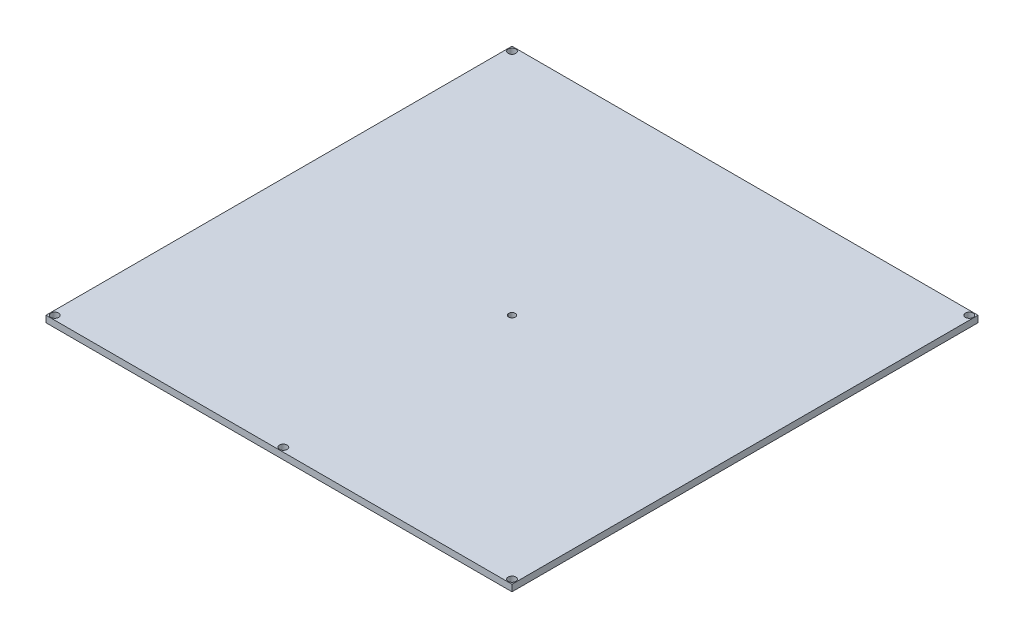
ISO-10303-21;
HEADER;
FILE_DESCRIPTION(('STEP AP214'),'2;1');
FILE_NAME('part.step','',(''),(''),'','','');
FILE_SCHEMA(('AUTOMOTIVE_DESIGN { 1 0 10303 214 1 1 1 1 }'));
ENDSEC;
DATA;
#1=APPLICATION_CONTEXT('core data for automotive mechanical design processes');
#2=APPLICATION_PROTOCOL_DEFINITION('international standard','automotive_design',2000,#1);
#3=PRODUCT_CONTEXT('',#1,'mechanical');
#4=PRODUCT('Part','Part','',(#3));
#5=PRODUCT_RELATED_PRODUCT_CATEGORY('part','',(#4));
#6=PRODUCT_DEFINITION_FORMATION('','',#4);
#7=PRODUCT_DEFINITION_CONTEXT('part definition',#1,'design');
#8=PRODUCT_DEFINITION('design','',#6,#7);
#9=PRODUCT_DEFINITION_SHAPE('','',#8);
#10=(LENGTH_UNIT() NAMED_UNIT(*) SI_UNIT(.MILLI.,.METRE.));
#11=(NAMED_UNIT(*) PLANE_ANGLE_UNIT() SI_UNIT($,.RADIAN.));
#12=(NAMED_UNIT(*) SI_UNIT($,.STERADIAN.) SOLID_ANGLE_UNIT());
#13=UNCERTAINTY_MEASURE_WITH_UNIT(LENGTH_MEASURE(1.E-05),#10,'distance_accuracy_value','');
#14=(GEOMETRIC_REPRESENTATION_CONTEXT(3) GLOBAL_UNCERTAINTY_ASSIGNED_CONTEXT((#13)) GLOBAL_UNIT_ASSIGNED_CONTEXT((#10,
#11,#12)) REPRESENTATION_CONTEXT('',''));
#15=CARTESIAN_POINT('',(0.,0.,0.));
#16=DIRECTION('',(0.,0.,1.));
#17=DIRECTION('',(1.,0.,0.));
#18=AXIS2_PLACEMENT_3D('',#15,#16,#17);
#19=CARTESIAN_POINT('',(0.,3.,0.));
#20=DIRECTION('',(0.,-1.,0.));
#21=DIRECTION('',(0.,0.,-1.));
#22=AXIS2_PLACEMENT_3D('',#19,#20,#21);
#23=PLANE('',#22);
#24=DIRECTION('',(0.,0.,-1.));
#25=VECTOR('',#24,1.);
#26=CARTESIAN_POINT('',(106.5,3.,106.5));
#27=LINE('',#26,#25);
#28=CARTESIAN_POINT('',(106.5,3.,106.5));
#29=VERTEX_POINT('',#28);
#30=CARTESIAN_POINT('',(106.5,3.,-106.5));
#31=VERTEX_POINT('',#30);
#32=EDGE_CURVE('E98',#29,#31,#27,.T.);
#33=ORIENTED_EDGE('',*,*,#32,.T.);
#34=DIRECTION('',(-1.,0.,0.));
#35=VECTOR('',#34,1.);
#36=CARTESIAN_POINT('',(-106.5,3.,-106.5));
#37=LINE('',#36,#35);
#38=CARTESIAN_POINT('',(-106.5,3.,-106.5));
#39=VERTEX_POINT('',#38);
#40=EDGE_CURVE('E93',#31,#39,#37,.T.);
#41=ORIENTED_EDGE('',*,*,#40,.T.);
#42=DIRECTION('',(0.,0.,1.));
#43=VECTOR('',#42,1.);
#44=CARTESIAN_POINT('',(-106.5,3.,106.5));
#45=LINE('',#44,#43);
#46=CARTESIAN_POINT('',(-106.5,3.,106.5));
#47=VERTEX_POINT('',#46);
#48=EDGE_CURVE('E96',#39,#47,#45,.T.);
#49=ORIENTED_EDGE('',*,*,#48,.T.);
#50=DIRECTION('',(1.,0.,0.));
#51=VECTOR('',#50,1.);
#52=CARTESIAN_POINT('',(-106.5,3.,106.5));
#53=LINE('',#52,#51);
#54=EDGE_CURVE('E63',#47,#29,#53,.T.);
#55=ORIENTED_EDGE('',*,*,#54,.T.);
#56=EDGE_LOOP('',(#33,#41,#49,#55));
#57=FACE_BOUND('',#56,.T.);
#58=CARTESIAN_POINT('',(-104.5,3.,-104.5));
#59=DIRECTION('',(0.,1.,0.));
#60=DIRECTION('',(0.,0.,1.));
#61=AXIS2_PLACEMENT_3D('',#58,#59,#60);
#62=CIRCLE('',#61,1.75);
#63=CARTESIAN_POINT('',(-104.5,3.,-102.75));
#64=VERTEX_POINT('',#63);
#65=EDGE_CURVE('E118',#64,#64,#62,.T.);
#66=ORIENTED_EDGE('',*,*,#65,.F.);
#67=EDGE_LOOP('',(#66));
#68=FACE_BOUND('',#67,.T.);
#69=CARTESIAN_POINT('',(2.15105711021124E-12,3.,104.5));
#70=DIRECTION('',(0.,1.,0.));
#71=DIRECTION('',(0.,0.,1.));
#72=AXIS2_PLACEMENT_3D('',#69,#70,#71);
#73=CIRCLE('',#72,1.75);
#74=CARTESIAN_POINT('',(2.15105711021124E-12,3.,106.25));
#75=VERTEX_POINT('',#74);
#76=EDGE_CURVE('E140',#75,#75,#73,.T.);
#77=ORIENTED_EDGE('',*,*,#76,.F.);
#78=EDGE_LOOP('',(#77));
#79=FACE_BOUND('',#78,.T.);
#80=CARTESIAN_POINT('',(104.5,3.,-104.5));
#81=DIRECTION('',(0.,1.,0.));
#82=DIRECTION('',(0.,0.,1.));
#83=AXIS2_PLACEMENT_3D('',#80,#81,#82);
#84=CIRCLE('',#83,1.75);
#85=CARTESIAN_POINT('',(104.5,3.,-102.75));
#86=VERTEX_POINT('',#85);
#87=EDGE_CURVE('E148',#86,#86,#84,.T.);
#88=ORIENTED_EDGE('',*,*,#87,.F.);
#89=EDGE_LOOP('',(#88));
#90=FACE_BOUND('',#89,.T.);
#91=CARTESIAN_POINT('',(-104.499999999998,3.,104.5));
#92=DIRECTION('',(0.,1.,0.));
#93=DIRECTION('',(0.,0.,1.));
#94=AXIS2_PLACEMENT_3D('',#91,#92,#93);
#95=CIRCLE('',#94,1.75);
#96=CARTESIAN_POINT('',(-104.499999999998,3.,106.25));
#97=VERTEX_POINT('',#96);
#98=EDGE_CURVE('E156',#97,#97,#95,.T.);
#99=ORIENTED_EDGE('',*,*,#98,.F.);
#100=EDGE_LOOP('',(#99));
#101=FACE_BOUND('',#100,.T.);
#102=CARTESIAN_POINT('',(104.500000000002,3.,104.5));
#103=DIRECTION('',(0.,1.,0.));
#104=DIRECTION('',(0.,0.,1.));
#105=AXIS2_PLACEMENT_3D('',#102,#103,#104);
#106=CIRCLE('',#105,1.75);
#107=CARTESIAN_POINT('',(104.500000000002,3.,106.25));
#108=VERTEX_POINT('',#107);
#109=EDGE_CURVE('E164',#108,#108,#106,.T.);
#110=ORIENTED_EDGE('',*,*,#109,.F.);
#111=EDGE_LOOP('',(#110));
#112=FACE_BOUND('',#111,.T.);
#113=CARTESIAN_POINT('',(0.,3.,0.));
#114=DIRECTION('',(0.,1.,0.));
#115=DIRECTION('',(0.,0.,1.));
#116=AXIS2_PLACEMENT_3D('',#113,#114,#115);
#117=CIRCLE('',#116,1.5);
#118=CARTESIAN_POINT('',(0.,3.,1.49999999999997));
#119=VERTEX_POINT('',#118);
#120=EDGE_CURVE('E172',#119,#119,#117,.T.);
#121=ORIENTED_EDGE('',*,*,#120,.F.);
#122=EDGE_LOOP('',(#121));
#123=FACE_BOUND('',#122,.T.);
#124=ADVANCED_FACE('F45',(#57,#68,#79,#90,#101,#112,#123),#23,.F.);
#125=CARTESIAN_POINT('',(0.,0.,0.));
#126=DIRECTION('',(0.,-1.,0.));
#127=DIRECTION('',(0.,0.,-1.));
#128=AXIS2_PLACEMENT_3D('',#125,#126,#127);
#129=PLANE('',#128);
#130=CARTESIAN_POINT('',(104.500000000002,0.,104.5));
#131=DIRECTION('',(0.,1.,0.));
#132=DIRECTION('',(0.,0.,1.));
#133=AXIS2_PLACEMENT_3D('',#130,#131,#132);
#134=CIRCLE('',#133,1.75);
#135=CARTESIAN_POINT('',(104.500000000002,0.,106.25));
#136=VERTEX_POINT('',#135);
#137=EDGE_CURVE('E168',#136,#136,#134,.T.);
#138=ORIENTED_EDGE('',*,*,#137,.T.);
#139=EDGE_LOOP('',(#138));
#140=FACE_BOUND('',#139,.T.);
#141=CARTESIAN_POINT('',(104.5,0.,-104.5));
#142=DIRECTION('',(0.,1.,0.));
#143=DIRECTION('',(0.,0.,1.));
#144=AXIS2_PLACEMENT_3D('',#141,#142,#143);
#145=CIRCLE('',#144,1.75);
#146=CARTESIAN_POINT('',(104.5,0.,-102.75));
#147=VERTEX_POINT('',#146);
#148=EDGE_CURVE('E152',#147,#147,#145,.T.);
#149=ORIENTED_EDGE('',*,*,#148,.T.);
#150=EDGE_LOOP('',(#149));
#151=FACE_BOUND('',#150,.T.);
#152=CARTESIAN_POINT('',(-104.5,0.,-104.5));
#153=DIRECTION('',(0.,1.,0.));
#154=DIRECTION('',(0.,0.,1.));
#155=AXIS2_PLACEMENT_3D('',#152,#153,#154);
#156=CIRCLE('',#155,1.75);
#157=CARTESIAN_POINT('',(-104.5,0.,-102.75));
#158=VERTEX_POINT('',#157);
#159=EDGE_CURVE('E136',#158,#158,#156,.T.);
#160=ORIENTED_EDGE('',*,*,#159,.T.);
#161=EDGE_LOOP('',(#160));
#162=FACE_BOUND('',#161,.T.);
#163=DIRECTION('',(0.,0.,-1.));
#164=VECTOR('',#163,1.);
#165=CARTESIAN_POINT('',(106.5,0.,106.5));
#166=LINE('',#165,#164);
#167=CARTESIAN_POINT('',(106.5,0.,106.5));
#168=VERTEX_POINT('',#167);
#169=CARTESIAN_POINT('',(106.5,0.,-106.5));
#170=VERTEX_POINT('',#169);
#171=EDGE_CURVE('E114',#168,#170,#166,.T.);
#172=ORIENTED_EDGE('',*,*,#171,.F.);
#173=DIRECTION('',(1.,0.,0.));
#174=VECTOR('',#173,1.);
#175=CARTESIAN_POINT('',(-106.5,0.,106.5));
#176=LINE('',#175,#174);
#177=CARTESIAN_POINT('',(-106.5,0.,106.5));
#178=VERTEX_POINT('',#177);
#179=EDGE_CURVE('E86',#178,#168,#176,.T.);
#180=ORIENTED_EDGE('',*,*,#179,.F.);
#181=DIRECTION('',(0.,0.,1.));
#182=VECTOR('',#181,1.);
#183=CARTESIAN_POINT('',(-106.5,0.,106.5));
#184=LINE('',#183,#182);
#185=CARTESIAN_POINT('',(-106.5,0.,-106.5));
#186=VERTEX_POINT('',#185);
#187=EDGE_CURVE('E80',#186,#178,#184,.T.);
#188=ORIENTED_EDGE('',*,*,#187,.F.);
#189=DIRECTION('',(-1.,0.,0.));
#190=VECTOR('',#189,1.);
#191=CARTESIAN_POINT('',(-106.5,0.,-106.5));
#192=LINE('',#191,#190);
#193=EDGE_CURVE('E103',#170,#186,#192,.T.);
#194=ORIENTED_EDGE('',*,*,#193,.F.);
#195=EDGE_LOOP('',(#172,#180,#188,#194));
#196=FACE_BOUND('',#195,.T.);
#197=CARTESIAN_POINT('',(2.15105711021124E-12,0.,104.5));
#198=DIRECTION('',(0.,1.,0.));
#199=DIRECTION('',(0.,0.,1.));
#200=AXIS2_PLACEMENT_3D('',#197,#198,#199);
#201=CIRCLE('',#200,1.75);
#202=CARTESIAN_POINT('',(2.15105711021124E-12,0.,106.25));
#203=VERTEX_POINT('',#202);
#204=EDGE_CURVE('E144',#203,#203,#201,.T.);
#205=ORIENTED_EDGE('',*,*,#204,.T.);
#206=EDGE_LOOP('',(#205));
#207=FACE_BOUND('',#206,.T.);
#208=CARTESIAN_POINT('',(-104.499999999998,0.,104.5));
#209=DIRECTION('',(0.,1.,0.));
#210=DIRECTION('',(0.,0.,1.));
#211=AXIS2_PLACEMENT_3D('',#208,#209,#210);
#212=CIRCLE('',#211,1.75);
#213=CARTESIAN_POINT('',(-104.499999999998,0.,106.25));
#214=VERTEX_POINT('',#213);
#215=EDGE_CURVE('E160',#214,#214,#212,.T.);
#216=ORIENTED_EDGE('',*,*,#215,.T.);
#217=EDGE_LOOP('',(#216));
#218=FACE_BOUND('',#217,.T.);
#219=CARTESIAN_POINT('',(0.,0.,0.));
#220=DIRECTION('',(0.,1.,0.));
#221=DIRECTION('',(0.,0.,1.));
#222=AXIS2_PLACEMENT_3D('',#219,#220,#221);
#223=CIRCLE('',#222,1.5);
#224=CARTESIAN_POINT('',(0.,0.,1.49999999999997));
#225=VERTEX_POINT('',#224);
#226=EDGE_CURVE('E176',#225,#225,#223,.T.);
#227=ORIENTED_EDGE('',*,*,#226,.T.);
#228=EDGE_LOOP('',(#227));
#229=FACE_BOUND('',#228,.T.);
#230=ADVANCED_FACE('F131',(#140,#151,#162,#196,#207,#218,#229),#129,.T.);
#231=CARTESIAN_POINT('',(106.5,3.,106.5));
#232=DIRECTION('',(-1.,0.,0.));
#233=DIRECTION('',(0.,0.,1.));
#234=AXIS2_PLACEMENT_3D('',#231,#232,#233);
#235=PLANE('',#234);
#236=ORIENTED_EDGE('',*,*,#171,.T.);
#237=DIRECTION('',(0.,-1.,0.));
#238=VECTOR('',#237,1.);
#239=CARTESIAN_POINT('',(106.5,3.,-106.5));
#240=LINE('',#239,#238);
#241=EDGE_CURVE('E11',#31,#170,#240,.T.);
#242=ORIENTED_EDGE('',*,*,#241,.F.);
#243=ORIENTED_EDGE('',*,*,#32,.F.);
#244=DIRECTION('',(0.,-1.,0.));
#245=VECTOR('',#244,1.);
#246=CARTESIAN_POINT('',(106.5,3.,106.5));
#247=LINE('',#246,#245);
#248=EDGE_CURVE('E110',#29,#168,#247,.T.);
#249=ORIENTED_EDGE('',*,*,#248,.T.);
#250=EDGE_LOOP('',(#236,#242,#243,#249));
#251=FACE_BOUND('',#250,.T.);
#252=ADVANCED_FACE('F47',(#251),#235,.F.);
#253=CARTESIAN_POINT('',(-106.5,3.,-106.5));
#254=DIRECTION('',(0.,0.,1.));
#255=DIRECTION('',(1.,0.,0.));
#256=AXIS2_PLACEMENT_3D('',#253,#254,#255);
#257=PLANE('',#256);
#258=ORIENTED_EDGE('',*,*,#193,.T.);
#259=DIRECTION('',(0.,-1.,0.));
#260=VECTOR('',#259,1.);
#261=CARTESIAN_POINT('',(-106.5,3.,-106.5));
#262=LINE('',#261,#260);
#263=EDGE_CURVE('E55',#39,#186,#262,.T.);
#264=ORIENTED_EDGE('',*,*,#263,.F.);
#265=ORIENTED_EDGE('',*,*,#40,.F.);
#266=ORIENTED_EDGE('',*,*,#241,.T.);
#267=EDGE_LOOP('',(#258,#264,#265,#266));
#268=FACE_BOUND('',#267,.T.);
#269=ADVANCED_FACE('F102',(#268),#257,.F.);
#270=CARTESIAN_POINT('',(-106.5,3.,106.5));
#271=DIRECTION('',(1.,0.,0.));
#272=DIRECTION('',(0.,0.,-1.));
#273=AXIS2_PLACEMENT_3D('',#270,#271,#272);
#274=PLANE('',#273);
#275=ORIENTED_EDGE('',*,*,#187,.T.);
#276=DIRECTION('',(0.,-1.,0.));
#277=VECTOR('',#276,1.);
#278=CARTESIAN_POINT('',(-106.5,3.,106.5));
#279=LINE('',#278,#277);
#280=EDGE_CURVE('E105',#47,#178,#279,.T.);
#281=ORIENTED_EDGE('',*,*,#280,.F.);
#282=ORIENTED_EDGE('',*,*,#48,.F.);
#283=ORIENTED_EDGE('',*,*,#263,.T.);
#284=EDGE_LOOP('',(#275,#281,#282,#283));
#285=FACE_BOUND('',#284,.T.);
#286=ADVANCED_FACE('F106',(#285),#274,.F.);
#287=CARTESIAN_POINT('',(-106.5,3.,106.5));
#288=DIRECTION('',(0.,0.,-1.));
#289=DIRECTION('',(-1.,0.,0.));
#290=AXIS2_PLACEMENT_3D('',#287,#288,#289);
#291=PLANE('',#290);
#292=ORIENTED_EDGE('',*,*,#179,.T.);
#293=ORIENTED_EDGE('',*,*,#248,.F.);
#294=ORIENTED_EDGE('',*,*,#54,.F.);
#295=ORIENTED_EDGE('',*,*,#280,.T.);
#296=EDGE_LOOP('',(#292,#293,#294,#295));
#297=FACE_BOUND('',#296,.T.);
#298=ADVANCED_FACE('F128',(#297),#291,.F.);
#299=CARTESIAN_POINT('',(-104.5,3.,-104.5));
#300=DIRECTION('',(0.,-1.,0.));
#301=DIRECTION('',(0.,0.,-1.));
#302=AXIS2_PLACEMENT_3D('',#299,#300,#301);
#303=CYLINDRICAL_SURFACE('',#302,1.75);
#304=ORIENTED_EDGE('',*,*,#65,.T.);
#305=EDGE_LOOP('',(#304));
#306=FACE_BOUND('',#305,.T.);
#307=ORIENTED_EDGE('',*,*,#159,.F.);
#308=EDGE_LOOP('',(#307));
#309=FACE_BOUND('',#308,.T.);
#310=ADVANCED_FACE('F195',(#306,#309),#303,.F.);
#311=CARTESIAN_POINT('',(2.15105711021124E-12,3.,104.5));
#312=DIRECTION('',(0.,-1.,0.));
#313=DIRECTION('',(0.,0.,-1.));
#314=AXIS2_PLACEMENT_3D('',#311,#312,#313);
#315=CYLINDRICAL_SURFACE('',#314,1.75);
#316=ORIENTED_EDGE('',*,*,#76,.T.);
#317=EDGE_LOOP('',(#316));
#318=FACE_BOUND('',#317,.T.);
#319=ORIENTED_EDGE('',*,*,#204,.F.);
#320=EDGE_LOOP('',(#319));
#321=FACE_BOUND('',#320,.T.);
#322=ADVANCED_FACE('F240',(#318,#321),#315,.F.);
#323=CARTESIAN_POINT('',(104.5,3.,-104.5));
#324=DIRECTION('',(0.,-1.,0.));
#325=DIRECTION('',(0.,0.,-1.));
#326=AXIS2_PLACEMENT_3D('',#323,#324,#325);
#327=CYLINDRICAL_SURFACE('',#326,1.75);
#328=ORIENTED_EDGE('',*,*,#87,.T.);
#329=EDGE_LOOP('',(#328));
#330=FACE_BOUND('',#329,.T.);
#331=ORIENTED_EDGE('',*,*,#148,.F.);
#332=EDGE_LOOP('',(#331));
#333=FACE_BOUND('',#332,.T.);
#334=ADVANCED_FACE('F248',(#330,#333),#327,.F.);
#335=CARTESIAN_POINT('',(-104.499999999998,3.,104.5));
#336=DIRECTION('',(0.,-1.,0.));
#337=DIRECTION('',(0.,0.,-1.));
#338=AXIS2_PLACEMENT_3D('',#335,#336,#337);
#339=CYLINDRICAL_SURFACE('',#338,1.75);
#340=ORIENTED_EDGE('',*,*,#98,.T.);
#341=EDGE_LOOP('',(#340));
#342=FACE_BOUND('',#341,.T.);
#343=ORIENTED_EDGE('',*,*,#215,.F.);
#344=EDGE_LOOP('',(#343));
#345=FACE_BOUND('',#344,.T.);
#346=ADVANCED_FACE('F256',(#342,#345),#339,.F.);
#347=CARTESIAN_POINT('',(104.500000000002,3.,104.5));
#348=DIRECTION('',(0.,-1.,0.));
#349=DIRECTION('',(0.,0.,-1.));
#350=AXIS2_PLACEMENT_3D('',#347,#348,#349);
#351=CYLINDRICAL_SURFACE('',#350,1.75);
#352=ORIENTED_EDGE('',*,*,#109,.T.);
#353=EDGE_LOOP('',(#352));
#354=FACE_BOUND('',#353,.T.);
#355=ORIENTED_EDGE('',*,*,#137,.F.);
#356=EDGE_LOOP('',(#355));
#357=FACE_BOUND('',#356,.T.);
#358=ADVANCED_FACE('F265',(#354,#357),#351,.F.);
#359=CARTESIAN_POINT('',(0.,3.,0.));
#360=DIRECTION('',(0.,-1.,0.));
#361=DIRECTION('',(0.,0.,-1.));
#362=AXIS2_PLACEMENT_3D('',#359,#360,#361);
#363=CYLINDRICAL_SURFACE('',#362,1.5);
#364=ORIENTED_EDGE('',*,*,#120,.T.);
#365=EDGE_LOOP('',(#364));
#366=FACE_BOUND('',#365,.T.);
#367=ORIENTED_EDGE('',*,*,#226,.F.);
#368=EDGE_LOOP('',(#367));
#369=FACE_BOUND('',#368,.T.);
#370=ADVANCED_FACE('F184',(#366,#369),#363,.F.);
#371=CLOSED_SHELL('',(#124,#230,#252,#269,#286,#298,#310,#322,#334,#346,#358,#370));
#372=MANIFOLD_SOLID_BREP('B2',#371);
#373=ADVANCED_BREP_SHAPE_REPRESENTATION('',(#18,#372),#14);
#374=SHAPE_DEFINITION_REPRESENTATION(#9,#373);
ENDSEC;
END-ISO-10303-21;
